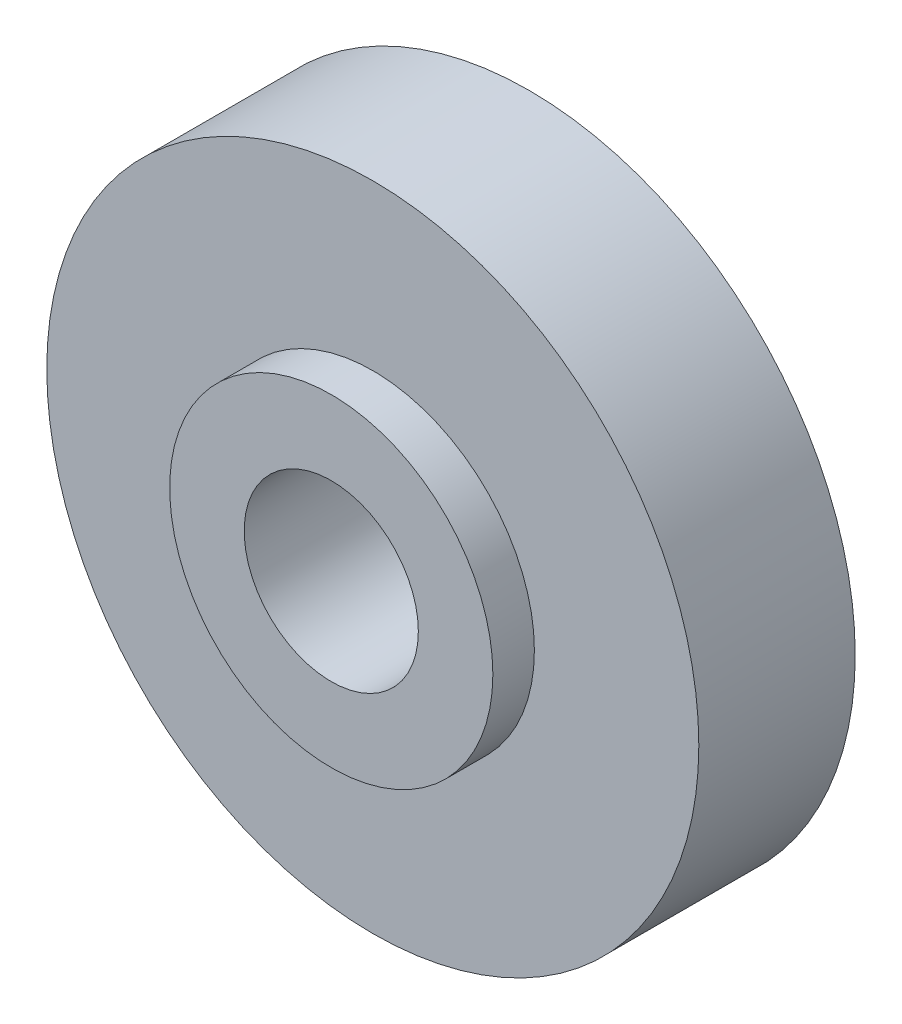
ISO-10303-21;
HEADER;
FILE_DESCRIPTION(('STEP AP214'),'2;1');
FILE_NAME('part.step','',(''),(''),'','','');
FILE_SCHEMA(('AUTOMOTIVE_DESIGN { 1 0 10303 214 1 1 1 1 }'));
ENDSEC;
DATA;
#1=APPLICATION_CONTEXT('core data for automotive mechanical design processes');
#2=APPLICATION_PROTOCOL_DEFINITION('international standard','automotive_design',2000,#1);
#3=PRODUCT_CONTEXT('',#1,'mechanical');
#4=PRODUCT('Part','Part','',(#3));
#5=PRODUCT_RELATED_PRODUCT_CATEGORY('part','',(#4));
#6=PRODUCT_DEFINITION_FORMATION('','',#4);
#7=PRODUCT_DEFINITION_CONTEXT('part definition',#1,'design');
#8=PRODUCT_DEFINITION('design','',#6,#7);
#9=PRODUCT_DEFINITION_SHAPE('','',#8);
#10=(LENGTH_UNIT() NAMED_UNIT(*) SI_UNIT(.MILLI.,.METRE.));
#11=(NAMED_UNIT(*) PLANE_ANGLE_UNIT() SI_UNIT($,.RADIAN.));
#12=(NAMED_UNIT(*) SI_UNIT($,.STERADIAN.) SOLID_ANGLE_UNIT());
#13=UNCERTAINTY_MEASURE_WITH_UNIT(LENGTH_MEASURE(1.E-05),#10,'distance_accuracy_value','');
#14=(GEOMETRIC_REPRESENTATION_CONTEXT(3) GLOBAL_UNCERTAINTY_ASSIGNED_CONTEXT((#13)) GLOBAL_UNIT_ASSIGNED_CONTEXT((#10,
#11,#12)) REPRESENTATION_CONTEXT('',''));
#15=CARTESIAN_POINT('',(0.,0.,0.));
#16=DIRECTION('',(0.,0.,1.));
#17=DIRECTION('',(1.,0.,0.));
#18=AXIS2_PLACEMENT_3D('',#15,#16,#17);
#19=CARTESIAN_POINT('',(0.,0.,9.0805));
#20=DIRECTION('',(0.,0.,-1.));
#21=DIRECTION('',(-1.,0.,0.));
#22=AXIS2_PLACEMENT_3D('',#19,#20,#21);
#23=CYLINDRICAL_SURFACE('',#22,6.604);
#24=CARTESIAN_POINT('',(0.,0.,9.0805));
#25=DIRECTION('',(0.,0.,1.));
#26=DIRECTION('',(1.,0.,0.));
#27=AXIS2_PLACEMENT_3D('',#24,#25,#26);
#28=CIRCLE('',#27,6.604);
#29=CARTESIAN_POINT('',(6.604,0.,9.0805));
#30=VERTEX_POINT('',#29);
#31=EDGE_CURVE('E54',#30,#30,#28,.T.);
#32=ORIENTED_EDGE('',*,*,#31,.T.);
#33=EDGE_LOOP('',(#32));
#34=FACE_BOUND('',#33,.T.);
#35=CARTESIAN_POINT('',(0.,0.,-9.0805));
#36=DIRECTION('',(0.,0.,1.));
#37=DIRECTION('',(1.,0.,0.));
#38=AXIS2_PLACEMENT_3D('',#35,#36,#37);
#39=CIRCLE('',#38,6.604);
#40=CARTESIAN_POINT('',(6.604,0.,-9.0805));
#41=VERTEX_POINT('',#40);
#42=EDGE_CURVE('E60',#41,#41,#39,.T.);
#43=ORIENTED_EDGE('',*,*,#42,.F.);
#44=EDGE_LOOP('',(#43));
#45=FACE_BOUND('',#44,.T.);
#46=ADVANCED_FACE('F47',(#34,#45),#23,.F.);
#47=CARTESIAN_POINT('',(0.,0.,9.0805));
#48=DIRECTION('',(0.,0.,-1.));
#49=DIRECTION('',(-1.,0.,0.));
#50=AXIS2_PLACEMENT_3D('',#47,#48,#49);
#51=CYLINDRICAL_SURFACE('',#50,12.2555);
#52=CARTESIAN_POINT('',(0.,0.,9.0805));
#53=DIRECTION('',(0.,0.,1.));
#54=DIRECTION('',(1.,0.,0.));
#55=AXIS2_PLACEMENT_3D('',#52,#53,#54);
#56=CIRCLE('',#55,12.2555);
#57=CARTESIAN_POINT('',(12.2555,0.,9.0805));
#58=VERTEX_POINT('',#57);
#59=EDGE_CURVE('E11',#58,#58,#56,.T.);
#60=ORIENTED_EDGE('',*,*,#59,.F.);
#61=EDGE_LOOP('',(#60));
#62=FACE_BOUND('',#61,.T.);
#63=CARTESIAN_POINT('',(0.,0.,-9.0805));
#64=DIRECTION('',(0.,0.,1.));
#65=DIRECTION('',(1.,0.,0.));
#66=AXIS2_PLACEMENT_3D('',#63,#64,#65);
#67=CIRCLE('',#66,12.2555);
#68=CARTESIAN_POINT('',(12.2555,0.,-9.0805));
#69=VERTEX_POINT('',#68);
#70=EDGE_CURVE('E50',#69,#69,#67,.T.);
#71=ORIENTED_EDGE('',*,*,#70,.T.);
#72=EDGE_LOOP('',(#71));
#73=FACE_BOUND('',#72,.T.);
#74=ADVANCED_FACE('F67',(#62,#73),#51,.T.);
#75=CARTESIAN_POINT('',(0.,0.,9.0805));
#76=DIRECTION('',(0.,0.,1.));
#77=DIRECTION('',(1.,0.,0.));
#78=AXIS2_PLACEMENT_3D('',#75,#76,#77);
#79=PLANE('',#78);
#80=ORIENTED_EDGE('',*,*,#31,.F.);
#81=EDGE_LOOP('',(#80));
#82=FACE_BOUND('',#81,.T.);
#83=ORIENTED_EDGE('',*,*,#59,.T.);
#84=EDGE_LOOP('',(#83));
#85=FACE_BOUND('',#84,.T.);
#86=ADVANCED_FACE('F71',(#82,#85),#79,.T.);
#87=CARTESIAN_POINT('',(0.,0.,-9.0805));
#88=DIRECTION('',(0.,0.,1.));
#89=DIRECTION('',(1.,0.,0.));
#90=AXIS2_PLACEMENT_3D('',#87,#88,#89);
#91=PLANE('',#90);
#92=ORIENTED_EDGE('',*,*,#42,.T.);
#93=EDGE_LOOP('',(#92));
#94=FACE_BOUND('',#93,.T.);
#95=ORIENTED_EDGE('',*,*,#70,.F.);
#96=EDGE_LOOP('',(#95));
#97=FACE_BOUND('',#96,.T.);
#98=ADVANCED_FACE('F69',(#94,#97),#91,.F.);
#99=CLOSED_SHELL('',(#46,#74,#86,#98));
#100=MANIFOLD_SOLID_BREP('B2',#99);
#101=CARTESIAN_POINT('',(0.,0.,5.9309));
#102=DIRECTION('',(0.,0.,-1.));
#103=DIRECTION('',(-1.,0.,0.));
#104=AXIS2_PLACEMENT_3D('',#101,#102,#103);
#105=CYLINDRICAL_SURFACE('',#104,12.2555);
#106=CARTESIAN_POINT('',(0.,0.,5.9309));
#107=DIRECTION('',(0.,0.,1.));
#108=DIRECTION('',(1.,0.,0.));
#109=AXIS2_PLACEMENT_3D('',#106,#107,#108);
#110=CIRCLE('',#109,12.2555);
#111=CARTESIAN_POINT('',(12.2555,0.,5.9309));
#112=VERTEX_POINT('',#111);
#113=EDGE_CURVE('E124',#112,#112,#110,.T.);
#114=ORIENTED_EDGE('',*,*,#113,.T.);
#115=EDGE_LOOP('',(#114));
#116=FACE_BOUND('',#115,.T.);
#117=CARTESIAN_POINT('',(0.,0.,-5.9309));
#118=DIRECTION('',(0.,0.,1.));
#119=DIRECTION('',(1.,0.,0.));
#120=AXIS2_PLACEMENT_3D('',#117,#118,#119);
#121=CIRCLE('',#120,12.2555);
#122=CARTESIAN_POINT('',(12.2555,0.,-5.9309));
#123=VERTEX_POINT('',#122);
#124=EDGE_CURVE('E130',#123,#123,#121,.T.);
#125=ORIENTED_EDGE('',*,*,#124,.F.);
#126=EDGE_LOOP('',(#125));
#127=FACE_BOUND('',#126,.T.);
#128=ADVANCED_FACE('F117',(#116,#127),#105,.F.);
#129=CARTESIAN_POINT('',(0.,0.,5.9309));
#130=DIRECTION('',(0.,0.,-1.));
#131=DIRECTION('',(-1.,0.,0.));
#132=AXIS2_PLACEMENT_3D('',#129,#130,#131);
#133=CYLINDRICAL_SURFACE('',#132,24.7269);
#134=CARTESIAN_POINT('',(0.,0.,5.9309));
#135=DIRECTION('',(0.,0.,1.));
#136=DIRECTION('',(1.,0.,0.));
#137=AXIS2_PLACEMENT_3D('',#134,#135,#136);
#138=CIRCLE('',#137,24.7269);
#139=CARTESIAN_POINT('',(24.7269,0.,5.9309));
#140=VERTEX_POINT('',#139);
#141=EDGE_CURVE('E46',#140,#140,#138,.T.);
#142=ORIENTED_EDGE('',*,*,#141,.F.);
#143=EDGE_LOOP('',(#142));
#144=FACE_BOUND('',#143,.T.);
#145=CARTESIAN_POINT('',(0.,0.,-5.9309));
#146=DIRECTION('',(0.,0.,1.));
#147=DIRECTION('',(1.,0.,0.));
#148=AXIS2_PLACEMENT_3D('',#145,#146,#147);
#149=CIRCLE('',#148,24.7269);
#150=CARTESIAN_POINT('',(24.7269,0.,-5.9309));
#151=VERTEX_POINT('',#150);
#152=EDGE_CURVE('E120',#151,#151,#149,.T.);
#153=ORIENTED_EDGE('',*,*,#152,.T.);
#154=EDGE_LOOP('',(#153));
#155=FACE_BOUND('',#154,.T.);
#156=ADVANCED_FACE('F137',(#144,#155),#133,.T.);
#157=CARTESIAN_POINT('',(0.,0.,5.9309));
#158=DIRECTION('',(0.,0.,1.));
#159=DIRECTION('',(1.,0.,0.));
#160=AXIS2_PLACEMENT_3D('',#157,#158,#159);
#161=PLANE('',#160);
#162=ORIENTED_EDGE('',*,*,#113,.F.);
#163=EDGE_LOOP('',(#162));
#164=FACE_BOUND('',#163,.T.);
#165=ORIENTED_EDGE('',*,*,#141,.T.);
#166=EDGE_LOOP('',(#165));
#167=FACE_BOUND('',#166,.T.);
#168=ADVANCED_FACE('F141',(#164,#167),#161,.T.);
#169=CARTESIAN_POINT('',(0.,0.,-5.9309));
#170=DIRECTION('',(0.,0.,1.));
#171=DIRECTION('',(1.,0.,0.));
#172=AXIS2_PLACEMENT_3D('',#169,#170,#171);
#173=PLANE('',#172);
#174=ORIENTED_EDGE('',*,*,#124,.T.);
#175=EDGE_LOOP('',(#174));
#176=FACE_BOUND('',#175,.T.);
#177=ORIENTED_EDGE('',*,*,#152,.F.);
#178=EDGE_LOOP('',(#177));
#179=FACE_BOUND('',#178,.T.);
#180=ADVANCED_FACE('F139',(#176,#179),#173,.F.);
#181=CLOSED_SHELL('',(#128,#156,#168,#180));
#182=MANIFOLD_SOLID_BREP('B6',#181);
#183=ADVANCED_BREP_SHAPE_REPRESENTATION('',(#18,#100,#182),#14);
#184=SHAPE_DEFINITION_REPRESENTATION(#9,#183);
ENDSEC;
END-ISO-10303-21;
